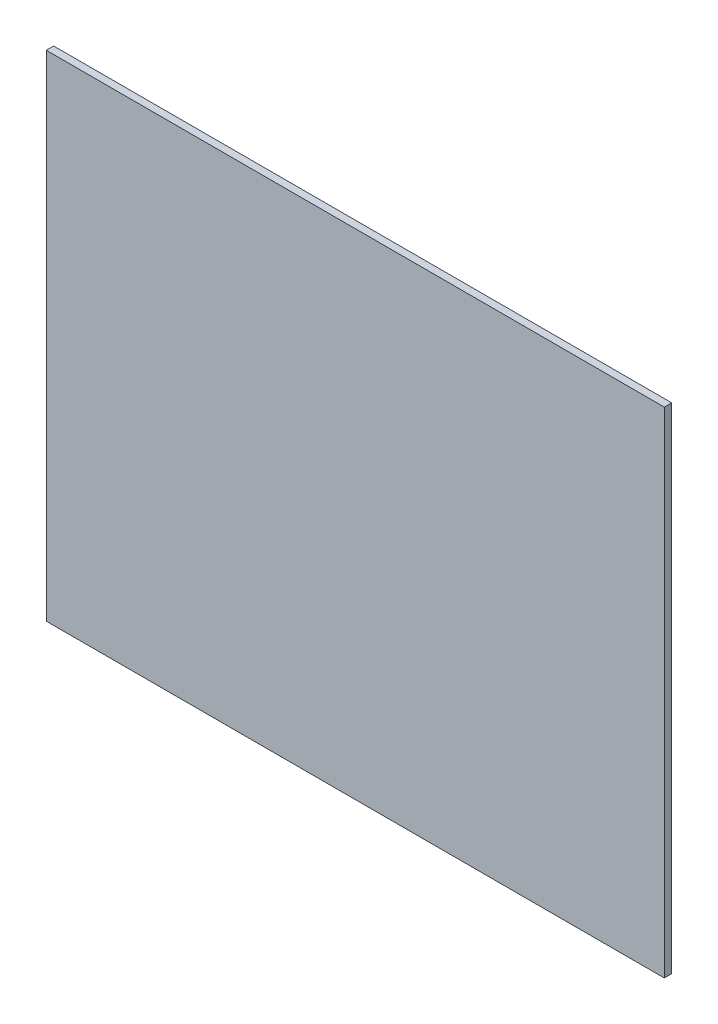
ISO-10303-21;
HEADER;
FILE_DESCRIPTION(('STEP AP214'),'2;1');
FILE_NAME('part.step','',(''),(''),'','','');
FILE_SCHEMA(('AUTOMOTIVE_DESIGN { 1 0 10303 214 1 1 1 1 }'));
ENDSEC;
DATA;
#1=APPLICATION_CONTEXT('core data for automotive mechanical design processes');
#2=APPLICATION_PROTOCOL_DEFINITION('international standard','automotive_design',2000,#1);
#3=PRODUCT_CONTEXT('',#1,'mechanical');
#4=PRODUCT('Part','Part','',(#3));
#5=PRODUCT_RELATED_PRODUCT_CATEGORY('part','',(#4));
#6=PRODUCT_DEFINITION_FORMATION('','',#4);
#7=PRODUCT_DEFINITION_CONTEXT('part definition',#1,'design');
#8=PRODUCT_DEFINITION('design','',#6,#7);
#9=PRODUCT_DEFINITION_SHAPE('','',#8);
#10=(LENGTH_UNIT() NAMED_UNIT(*) SI_UNIT(.MILLI.,.METRE.));
#11=(NAMED_UNIT(*) PLANE_ANGLE_UNIT() SI_UNIT($,.RADIAN.));
#12=(NAMED_UNIT(*) SI_UNIT($,.STERADIAN.) SOLID_ANGLE_UNIT());
#13=UNCERTAINTY_MEASURE_WITH_UNIT(LENGTH_MEASURE(1.E-05),#10,'distance_accuracy_value','');
#14=(GEOMETRIC_REPRESENTATION_CONTEXT(3) GLOBAL_UNCERTAINTY_ASSIGNED_CONTEXT((#13)) GLOBAL_UNIT_ASSIGNED_CONTEXT((#10,
#11,#12)) REPRESENTATION_CONTEXT('',''));
#15=CARTESIAN_POINT('',(0.,0.,0.));
#16=DIRECTION('',(0.,0.,1.));
#17=DIRECTION('',(1.,0.,0.));
#18=AXIS2_PLACEMENT_3D('',#15,#16,#17);
#19=CARTESIAN_POINT('',(0.,0.,6.));
#20=DIRECTION('',(1.,0.,0.));
#21=DIRECTION('',(0.,1.,0.));
#22=AXIS2_PLACEMENT_3D('',#19,#20,#21);
#23=PLANE('',#22);
#24=DIRECTION('',(0.,-1.,0.));
#25=VECTOR('',#24,1.);
#26=CARTESIAN_POINT('',(0.,0.,0.));
#27=LINE('',#26,#25);
#28=CARTESIAN_POINT('',(0.,0.,0.));
#29=VERTEX_POINT('',#28);
#30=CARTESIAN_POINT('',(0.,-400.,0.));
#31=VERTEX_POINT('',#30);
#32=EDGE_CURVE('E103',#29,#31,#27,.T.);
#33=ORIENTED_EDGE('',*,*,#32,.T.);
#34=DIRECTION('',(0.,0.,-1.));
#35=VECTOR('',#34,1.);
#36=CARTESIAN_POINT('',(0.,-400.,6.));
#37=LINE('',#36,#35);
#38=CARTESIAN_POINT('',(0.,-400.,6.));
#39=VERTEX_POINT('',#38);
#40=EDGE_CURVE('E11',#39,#31,#37,.T.);
#41=ORIENTED_EDGE('',*,*,#40,.F.);
#42=DIRECTION('',(0.,-1.,0.));
#43=VECTOR('',#42,1.);
#44=CARTESIAN_POINT('',(0.,0.,6.));
#45=LINE('',#44,#43);
#46=CARTESIAN_POINT('',(0.,0.,6.));
#47=VERTEX_POINT('',#46);
#48=EDGE_CURVE('E91',#47,#39,#45,.T.);
#49=ORIENTED_EDGE('',*,*,#48,.F.);
#50=DIRECTION('',(0.,0.,-1.));
#51=VECTOR('',#50,1.);
#52=CARTESIAN_POINT('',(0.,0.,6.));
#53=LINE('',#52,#51);
#54=EDGE_CURVE('E99',#47,#29,#53,.T.);
#55=ORIENTED_EDGE('',*,*,#54,.T.);
#56=EDGE_LOOP('',(#33,#41,#49,#55));
#57=FACE_BOUND('',#56,.T.);
#58=ADVANCED_FACE('F40',(#57),#23,.F.);
#59=CARTESIAN_POINT('',(0.,-400.,6.));
#60=DIRECTION('',(0.,1.,0.));
#61=DIRECTION('',(0.,0.,1.));
#62=AXIS2_PLACEMENT_3D('',#59,#60,#61);
#63=PLANE('',#62);
#64=DIRECTION('',(1.,0.,0.));
#65=VECTOR('',#64,1.);
#66=CARTESIAN_POINT('',(0.,-400.,0.));
#67=LINE('',#66,#65);
#68=CARTESIAN_POINT('',(500.,-400.,0.));
#69=VERTEX_POINT('',#68);
#70=EDGE_CURVE('E95',#31,#69,#67,.T.);
#71=ORIENTED_EDGE('',*,*,#70,.T.);
#72=DIRECTION('',(0.,0.,-1.));
#73=VECTOR('',#72,1.);
#74=CARTESIAN_POINT('',(500.,-400.,6.));
#75=LINE('',#74,#73);
#76=CARTESIAN_POINT('',(500.,-400.,6.));
#77=VERTEX_POINT('',#76);
#78=EDGE_CURVE('E48',#77,#69,#75,.T.);
#79=ORIENTED_EDGE('',*,*,#78,.F.);
#80=DIRECTION('',(1.,0.,0.));
#81=VECTOR('',#80,1.);
#82=CARTESIAN_POINT('',(0.,-400.,6.));
#83=LINE('',#82,#81);
#84=EDGE_CURVE('E86',#39,#77,#83,.T.);
#85=ORIENTED_EDGE('',*,*,#84,.F.);
#86=ORIENTED_EDGE('',*,*,#40,.T.);
#87=EDGE_LOOP('',(#71,#79,#85,#86));
#88=FACE_BOUND('',#87,.T.);
#89=ADVANCED_FACE('F94',(#88),#63,.F.);
#90=CARTESIAN_POINT('',(500.,0.,6.));
#91=DIRECTION('',(-1.,0.,0.));
#92=DIRECTION('',(0.,0.,1.));
#93=AXIS2_PLACEMENT_3D('',#90,#91,#92);
#94=PLANE('',#93);
#95=DIRECTION('',(0.,1.,0.));
#96=VECTOR('',#95,1.);
#97=CARTESIAN_POINT('',(500.,0.,0.));
#98=LINE('',#97,#96);
#99=CARTESIAN_POINT('',(500.,0.,0.));
#100=VERTEX_POINT('',#99);
#101=EDGE_CURVE('E73',#69,#100,#98,.T.);
#102=ORIENTED_EDGE('',*,*,#101,.T.);
#103=DIRECTION('',(0.,0.,-1.));
#104=VECTOR('',#103,1.);
#105=CARTESIAN_POINT('',(500.,0.,6.));
#106=LINE('',#105,#104);
#107=CARTESIAN_POINT('',(500.,0.,6.));
#108=VERTEX_POINT('',#107);
#109=EDGE_CURVE('E96',#108,#100,#106,.T.);
#110=ORIENTED_EDGE('',*,*,#109,.F.);
#111=DIRECTION('',(0.,1.,0.));
#112=VECTOR('',#111,1.);
#113=CARTESIAN_POINT('',(500.,0.,6.));
#114=LINE('',#113,#112);
#115=EDGE_CURVE('E89',#77,#108,#114,.T.);
#116=ORIENTED_EDGE('',*,*,#115,.F.);
#117=ORIENTED_EDGE('',*,*,#78,.T.);
#118=EDGE_LOOP('',(#102,#110,#116,#117));
#119=FACE_BOUND('',#118,.T.);
#120=ADVANCED_FACE('F97',(#119),#94,.F.);
#121=CARTESIAN_POINT('',(0.,0.,6.));
#122=DIRECTION('',(0.,-1.,0.));
#123=DIRECTION('',(0.,0.,-1.));
#124=AXIS2_PLACEMENT_3D('',#121,#122,#123);
#125=PLANE('',#124);
#126=DIRECTION('',(-1.,0.,0.));
#127=VECTOR('',#126,1.);
#128=CARTESIAN_POINT('',(0.,0.,0.));
#129=LINE('',#128,#127);
#130=EDGE_CURVE('E79',#100,#29,#129,.T.);
#131=ORIENTED_EDGE('',*,*,#130,.T.);
#132=ORIENTED_EDGE('',*,*,#54,.F.);
#133=DIRECTION('',(-1.,0.,0.));
#134=VECTOR('',#133,1.);
#135=CARTESIAN_POINT('',(0.,0.,6.));
#136=LINE('',#135,#134);
#137=EDGE_CURVE('E56',#108,#47,#136,.T.);
#138=ORIENTED_EDGE('',*,*,#137,.F.);
#139=ORIENTED_EDGE('',*,*,#109,.T.);
#140=EDGE_LOOP('',(#131,#132,#138,#139));
#141=FACE_BOUND('',#140,.T.);
#142=ADVANCED_FACE('F110',(#141),#125,.F.);
#143=CARTESIAN_POINT('',(0.,0.,6.));
#144=DIRECTION('',(0.,0.,1.));
#145=DIRECTION('',(1.,0.,0.));
#146=AXIS2_PLACEMENT_3D('',#143,#144,#145);
#147=PLANE('',#146);
#148=ORIENTED_EDGE('',*,*,#48,.T.);
#149=ORIENTED_EDGE('',*,*,#84,.T.);
#150=ORIENTED_EDGE('',*,*,#115,.T.);
#151=ORIENTED_EDGE('',*,*,#137,.T.);
#152=EDGE_LOOP('',(#148,#149,#150,#151));
#153=FACE_BOUND('',#152,.T.);
#154=ADVANCED_FACE('F87',(#153),#147,.T.);
#155=CARTESIAN_POINT('',(0.,0.,0.));
#156=DIRECTION('',(0.,0.,1.));
#157=DIRECTION('',(1.,0.,0.));
#158=AXIS2_PLACEMENT_3D('',#155,#156,#157);
#159=PLANE('',#158);
#160=ORIENTED_EDGE('',*,*,#32,.F.);
#161=ORIENTED_EDGE('',*,*,#130,.F.);
#162=ORIENTED_EDGE('',*,*,#101,.F.);
#163=ORIENTED_EDGE('',*,*,#70,.F.);
#164=EDGE_LOOP('',(#160,#161,#162,#163));
#165=FACE_BOUND('',#164,.T.);
#166=ADVANCED_FACE('F113',(#165),#159,.F.);
#167=CLOSED_SHELL('',(#58,#89,#120,#142,#154,#166));
#168=MANIFOLD_SOLID_BREP('B2',#167);
#169=ADVANCED_BREP_SHAPE_REPRESENTATION('',(#18,#168),#14);
#170=SHAPE_DEFINITION_REPRESENTATION(#9,#169);
ENDSEC;
END-ISO-10303-21;
